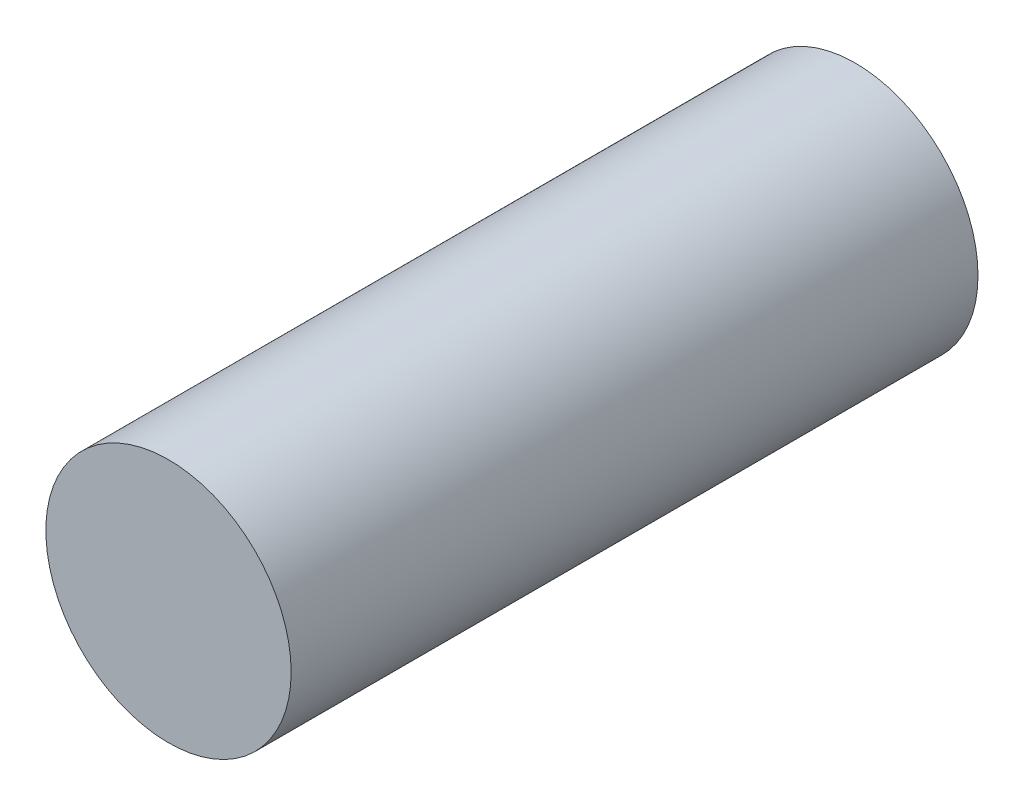
ISO-10303-21;
HEADER;
FILE_DESCRIPTION(('STEP AP214'),'2;1');
FILE_NAME('part.step','',(''),(''),'','','');
FILE_SCHEMA(('AUTOMOTIVE_DESIGN { 1 0 10303 214 1 1 1 1 }'));
ENDSEC;
DATA;
#1=APPLICATION_CONTEXT('core data for automotive mechanical design processes');
#2=APPLICATION_PROTOCOL_DEFINITION('international standard','automotive_design',2000,#1);
#3=PRODUCT_CONTEXT('',#1,'mechanical');
#4=PRODUCT('Part','Part','',(#3));
#5=PRODUCT_RELATED_PRODUCT_CATEGORY('part','',(#4));
#6=PRODUCT_DEFINITION_FORMATION('','',#4);
#7=PRODUCT_DEFINITION_CONTEXT('part definition',#1,'design');
#8=PRODUCT_DEFINITION('design','',#6,#7);
#9=PRODUCT_DEFINITION_SHAPE('','',#8);
#10=(LENGTH_UNIT() NAMED_UNIT(*) SI_UNIT(.MILLI.,.METRE.));
#11=(NAMED_UNIT(*) PLANE_ANGLE_UNIT() SI_UNIT($,.RADIAN.));
#12=(NAMED_UNIT(*) SI_UNIT($,.STERADIAN.) SOLID_ANGLE_UNIT());
#13=UNCERTAINTY_MEASURE_WITH_UNIT(LENGTH_MEASURE(1.E-05),#10,'distance_accuracy_value','');
#14=(GEOMETRIC_REPRESENTATION_CONTEXT(3) GLOBAL_UNCERTAINTY_ASSIGNED_CONTEXT((#13)) GLOBAL_UNIT_ASSIGNED_CONTEXT((#10,
#11,#12)) REPRESENTATION_CONTEXT('',''));
#15=CARTESIAN_POINT('',(0.,0.,0.));
#16=DIRECTION('',(0.,0.,1.));
#17=DIRECTION('',(1.,0.,0.));
#18=AXIS2_PLACEMENT_3D('',#15,#16,#17);
#19=CARTESIAN_POINT('',(0.,0.,14.));
#20=DIRECTION('',(0.,0.,-1.));
#21=DIRECTION('',(-1.,0.,0.));
#22=AXIS2_PLACEMENT_3D('',#19,#20,#21);
#23=CYLINDRICAL_SURFACE('',#22,2.5);
#24=CARTESIAN_POINT('',(0.,0.,14.));
#25=DIRECTION('',(0.,0.,1.));
#26=DIRECTION('',(1.,0.,0.));
#27=AXIS2_PLACEMENT_3D('',#24,#25,#26);
#28=CIRCLE('',#27,2.5);
#29=CARTESIAN_POINT('',(2.5,0.,14.));
#30=VERTEX_POINT('',#29);
#31=EDGE_CURVE('E10',#30,#30,#28,.T.);
#32=ORIENTED_EDGE('',*,*,#31,.F.);
#33=EDGE_LOOP('',(#32));
#34=FACE_BOUND('',#33,.T.);
#35=CARTESIAN_POINT('',(0.,0.,0.));
#36=DIRECTION('',(0.,0.,1.));
#37=DIRECTION('',(1.,0.,0.));
#38=AXIS2_PLACEMENT_3D('',#35,#36,#37);
#39=CIRCLE('',#38,2.5);
#40=CARTESIAN_POINT('',(2.5,0.,0.));
#41=VERTEX_POINT('',#40);
#42=EDGE_CURVE('E38',#41,#41,#39,.T.);
#43=ORIENTED_EDGE('',*,*,#42,.T.);
#44=EDGE_LOOP('',(#43));
#45=FACE_BOUND('',#44,.T.);
#46=ADVANCED_FACE('F35',(#34,#45),#23,.T.);
#47=CARTESIAN_POINT('',(0.,0.,14.));
#48=DIRECTION('',(0.,0.,1.));
#49=DIRECTION('',(1.,0.,0.));
#50=AXIS2_PLACEMENT_3D('',#47,#48,#49);
#51=PLANE('',#50);
#52=ORIENTED_EDGE('',*,*,#31,.T.);
#53=EDGE_LOOP('',(#52));
#54=FACE_BOUND('',#53,.T.);
#55=ADVANCED_FACE('F50',(#54),#51,.T.);
#56=CARTESIAN_POINT('',(0.,0.,0.));
#57=DIRECTION('',(0.,0.,1.));
#58=DIRECTION('',(1.,0.,0.));
#59=AXIS2_PLACEMENT_3D('',#56,#57,#58);
#60=PLANE('',#59);
#61=ORIENTED_EDGE('',*,*,#42,.F.);
#62=EDGE_LOOP('',(#61));
#63=FACE_BOUND('',#62,.T.);
#64=ADVANCED_FACE('F48',(#63),#60,.F.);
#65=CLOSED_SHELL('',(#46,#55,#64));
#66=MANIFOLD_SOLID_BREP('B2',#65);
#67=ADVANCED_BREP_SHAPE_REPRESENTATION('',(#18,#66),#14);
#68=SHAPE_DEFINITION_REPRESENTATION(#9,#67);
ENDSEC;
END-ISO-10303-21;
